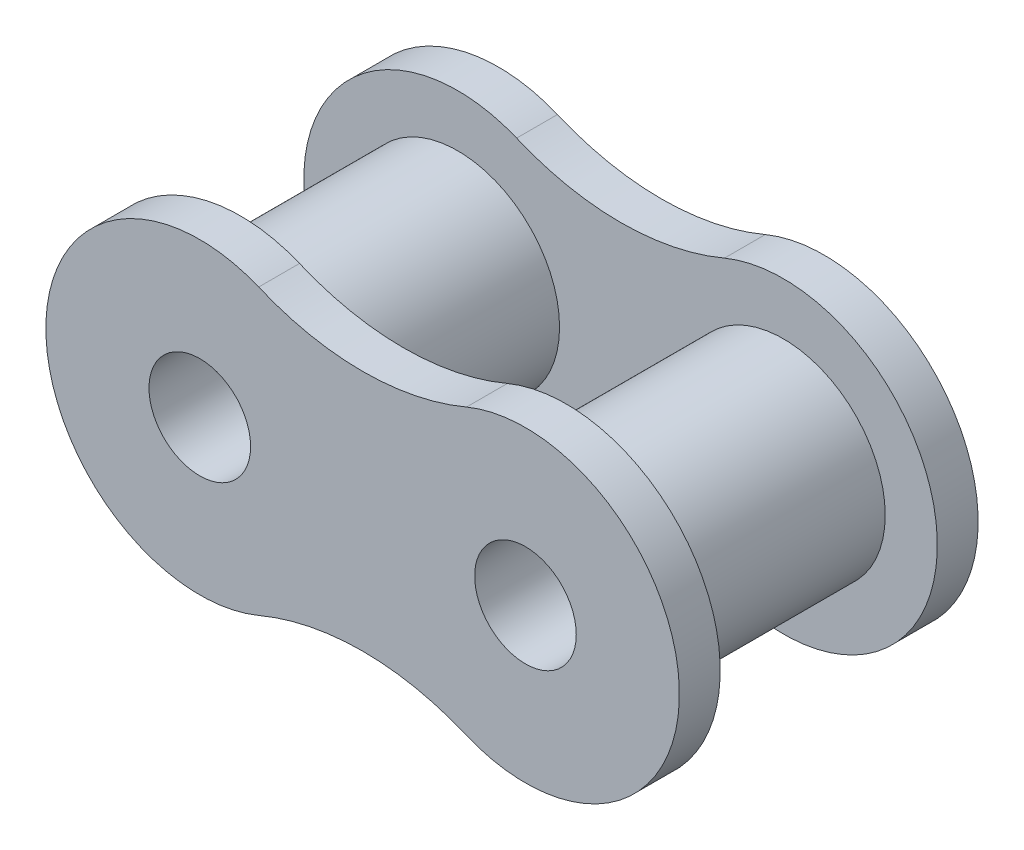
ISO-10303-21;
HEADER;
FILE_DESCRIPTION(('STEP AP214'),'2;1');
FILE_NAME('part.step','',(''),(''),'','','');
FILE_SCHEMA(('AUTOMOTIVE_DESIGN { 1 0 10303 214 1 1 1 1 }'));
ENDSEC;
DATA;
#1=APPLICATION_CONTEXT('core data for automotive mechanical design processes');
#2=APPLICATION_PROTOCOL_DEFINITION('international standard','automotive_design',2000,#1);
#3=PRODUCT_CONTEXT('',#1,'mechanical');
#4=PRODUCT('Part','Part','',(#3));
#5=PRODUCT_RELATED_PRODUCT_CATEGORY('part','',(#4));
#6=PRODUCT_DEFINITION_FORMATION('','',#4);
#7=PRODUCT_DEFINITION_CONTEXT('part definition',#1,'design');
#8=PRODUCT_DEFINITION('design','',#6,#7);
#9=PRODUCT_DEFINITION_SHAPE('','',#8);
#10=(LENGTH_UNIT() NAMED_UNIT(*) SI_UNIT(.MILLI.,.METRE.));
#11=(NAMED_UNIT(*) PLANE_ANGLE_UNIT() SI_UNIT($,.RADIAN.));
#12=(NAMED_UNIT(*) SI_UNIT($,.STERADIAN.) SOLID_ANGLE_UNIT());
#13=UNCERTAINTY_MEASURE_WITH_UNIT(LENGTH_MEASURE(1.E-05),#10,'distance_accuracy_value','');
#14=(GEOMETRIC_REPRESENTATION_CONTEXT(3) GLOBAL_UNCERTAINTY_ASSIGNED_CONTEXT((#13)) GLOBAL_UNIT_ASSIGNED_CONTEXT((#10,
#11,#12)) REPRESENTATION_CONTEXT('',''));
#15=CARTESIAN_POINT('',(0.,0.,0.));
#16=DIRECTION('',(0.,0.,1.));
#17=DIRECTION('',(1.,0.,0.));
#18=AXIS2_PLACEMENT_3D('',#15,#16,#17);
#19=CARTESIAN_POINT('',(0.,0.,2.3876));
#20=DIRECTION('',(0.,0.,1.));
#21=DIRECTION('',(1.,0.,0.));
#22=AXIS2_PLACEMENT_3D('',#19,#20,#21);
#23=PLANE('',#22);
#24=CARTESIAN_POINT('',(9.525,0.,2.3876));
#25=DIRECTION('',(0.,0.,1.));
#26=DIRECTION('',(1.,0.,0.));
#27=AXIS2_PLACEMENT_3D('',#24,#25,#26);
#28=CIRCLE('',#27,5.9563);
#29=CARTESIAN_POINT('',(15.4813,0.,2.3876));
#30=VERTEX_POINT('',#29);
#31=EDGE_CURVE('E144',#30,#30,#28,.T.);
#32=ORIENTED_EDGE('',*,*,#31,.F.);
#33=EDGE_LOOP('',(#32));
#34=FACE_BOUND('',#33,.T.);
#35=CARTESIAN_POINT('',(9.525,0.,2.3876));
#36=DIRECTION('',(0.,0.,1.));
#37=DIRECTION('',(1.,0.,0.));
#38=AXIS2_PLACEMENT_3D('',#35,#36,#37);
#39=CIRCLE('',#38,9.0043);
#40=CARTESIAN_POINT('',(6.07920356996496,-8.31888847459549,2.3876));
#41=VERTEX_POINT('',#40);
#42=CARTESIAN_POINT('',(6.07920356996453,8.31888847459532,2.3876));
#43=VERTEX_POINT('',#42);
#44=EDGE_CURVE('E79',#41,#43,#39,.T.);
#45=ORIENTED_EDGE('',*,*,#44,.T.);
#46=CARTESIAN_POINT('',(0.,22.6802142904542,2.3876));
#47=DIRECTION('',(0.,0.,1.));
#48=DIRECTION('',(1.,0.,0.));
#49=AXIS2_PLACEMENT_3D('',#46,#47,#48);
#50=CIRCLE('',#49,15.5950118702848);
#51=CARTESIAN_POINT('',(-6.07920356996596,8.31888847459591,2.3876));
#52=VERTEX_POINT('',#51);
#53=EDGE_CURVE('E153',#52,#43,#50,.T.);
#54=ORIENTED_EDGE('',*,*,#53,.F.);
#55=CARTESIAN_POINT('',(-9.525,0.,2.3876));
#56=DIRECTION('',(0.,0.,1.));
#57=DIRECTION('',(1.,0.,0.));
#58=AXIS2_PLACEMENT_3D('',#55,#56,#57);
#59=CIRCLE('',#58,9.0043);
#60=CARTESIAN_POINT('',(-6.07920356996638,-8.31888847459608,2.3876));
#61=VERTEX_POINT('',#60);
#62=EDGE_CURVE('E157',#52,#61,#59,.T.);
#63=ORIENTED_EDGE('',*,*,#62,.T.);
#64=CARTESIAN_POINT('',(0.,-22.6802142904542,2.3876));
#65=DIRECTION('',(0.,0.,1.));
#66=DIRECTION('',(1.,0.,0.));
#67=AXIS2_PLACEMENT_3D('',#64,#65,#66);
#68=CIRCLE('',#67,15.5950118702848);
#69=EDGE_CURVE('E52',#61,#41,#68,.F.);
#70=ORIENTED_EDGE('',*,*,#69,.T.);
#71=EDGE_LOOP('',(#45,#54,#63,#70));
#72=FACE_BOUND('',#71,.T.);
#73=CARTESIAN_POINT('',(-9.525,0.,2.3876));
#74=DIRECTION('',(0.,0.,1.));
#75=DIRECTION('',(1.,0.,0.));
#76=AXIS2_PLACEMENT_3D('',#73,#74,#75);
#77=CIRCLE('',#76,5.9563);
#78=CARTESIAN_POINT('',(-3.5687,0.,2.3876));
#79=VERTEX_POINT('',#78);
#80=EDGE_CURVE('E134',#79,#79,#77,.T.);
#81=ORIENTED_EDGE('',*,*,#80,.F.);
#82=EDGE_LOOP('',(#81));
#83=FACE_BOUND('',#82,.T.);
#84=ADVANCED_FACE('F35',(#34,#72,#83),#23,.T.);
#85=CARTESIAN_POINT('',(9.525,0.,2.3876));
#86=DIRECTION('',(0.,0.,-1.));
#87=DIRECTION('',(-1.,0.,0.));
#88=AXIS2_PLACEMENT_3D('',#85,#86,#87);
#89=CYLINDRICAL_SURFACE('',#88,9.0043);
#90=CARTESIAN_POINT('',(9.525,0.,0.));
#91=DIRECTION('',(0.,0.,1.));
#92=DIRECTION('',(1.,0.,0.));
#93=AXIS2_PLACEMENT_3D('',#90,#91,#92);
#94=CIRCLE('',#93,9.0043);
#95=CARTESIAN_POINT('',(6.07920356996496,-8.31888847459549,0.));
#96=VERTEX_POINT('',#95);
#97=CARTESIAN_POINT('',(6.07920356996453,8.31888847459532,0.));
#98=VERTEX_POINT('',#97);
#99=EDGE_CURVE('E149',#96,#98,#94,.T.);
#100=ORIENTED_EDGE('',*,*,#99,.T.);
#101=DIRECTION('',(0.,0.,-1.));
#102=VECTOR('',#101,1.);
#103=CARTESIAN_POINT('',(6.07920356996453,8.31888847459532,2.3876));
#104=LINE('',#103,#102);
#105=EDGE_CURVE('E11',#43,#98,#104,.T.);
#106=ORIENTED_EDGE('',*,*,#105,.F.);
#107=ORIENTED_EDGE('',*,*,#44,.F.);
#108=DIRECTION('',(0.,0.,-1.));
#109=VECTOR('',#108,1.);
#110=CARTESIAN_POINT('',(6.07920356996496,-8.31888847459549,2.3876));
#111=LINE('',#110,#109);
#112=EDGE_CURVE('E160',#41,#96,#111,.T.);
#113=ORIENTED_EDGE('',*,*,#112,.T.);
#114=EDGE_LOOP('',(#100,#106,#107,#113));
#115=FACE_BOUND('',#114,.T.);
#116=ADVANCED_FACE('F37',(#115),#89,.T.);
#117=CARTESIAN_POINT('',(0.,22.6802142904542,2.3876));
#118=DIRECTION('',(0.,0.,-1.));
#119=DIRECTION('',(-1.,0.,0.));
#120=AXIS2_PLACEMENT_3D('',#117,#118,#119);
#121=CYLINDRICAL_SURFACE('',#120,15.5950118702848);
#122=CARTESIAN_POINT('',(0.,22.6802142904542,0.));
#123=DIRECTION('',(0.,0.,1.));
#124=DIRECTION('',(1.,0.,0.));
#125=AXIS2_PLACEMENT_3D('',#122,#123,#124);
#126=CIRCLE('',#125,15.5950118702848);
#127=CARTESIAN_POINT('',(-6.07920356996596,8.31888847459591,0.));
#128=VERTEX_POINT('',#127);
#129=EDGE_CURVE('E163',#128,#98,#126,.T.);
#130=ORIENTED_EDGE('',*,*,#129,.F.);
#131=DIRECTION('',(0.,0.,-1.));
#132=VECTOR('',#131,1.);
#133=CARTESIAN_POINT('',(-6.07920356996596,8.31888847459591,2.3876));
#134=LINE('',#133,#132);
#135=EDGE_CURVE('E44',#52,#128,#134,.T.);
#136=ORIENTED_EDGE('',*,*,#135,.F.);
#137=ORIENTED_EDGE('',*,*,#53,.T.);
#138=ORIENTED_EDGE('',*,*,#105,.T.);
#139=EDGE_LOOP('',(#130,#136,#137,#138));
#140=FACE_BOUND('',#139,.T.);
#141=ADVANCED_FACE('F183',(#140),#121,.F.);
#142=CARTESIAN_POINT('',(-9.525,0.,2.3876));
#143=DIRECTION('',(0.,0.,-1.));
#144=DIRECTION('',(-1.,0.,0.));
#145=AXIS2_PLACEMENT_3D('',#142,#143,#144);
#146=CYLINDRICAL_SURFACE('',#145,9.0043);
#147=CARTESIAN_POINT('',(-9.525,0.,0.));
#148=DIRECTION('',(0.,0.,1.));
#149=DIRECTION('',(1.,0.,0.));
#150=AXIS2_PLACEMENT_3D('',#147,#148,#149);
#151=CIRCLE('',#150,9.0043);
#152=CARTESIAN_POINT('',(-6.07920356996638,-8.31888847459608,0.));
#153=VERTEX_POINT('',#152);
#154=EDGE_CURVE('E68',#128,#153,#151,.T.);
#155=ORIENTED_EDGE('',*,*,#154,.T.);
#156=DIRECTION('',(0.,0.,-1.));
#157=VECTOR('',#156,1.);
#158=CARTESIAN_POINT('',(-6.07920356996638,-8.31888847459608,2.3876));
#159=LINE('',#158,#157);
#160=EDGE_CURVE('E174',#61,#153,#159,.T.);
#161=ORIENTED_EDGE('',*,*,#160,.F.);
#162=ORIENTED_EDGE('',*,*,#62,.F.);
#163=ORIENTED_EDGE('',*,*,#135,.T.);
#164=EDGE_LOOP('',(#155,#161,#162,#163));
#165=FACE_BOUND('',#164,.T.);
#166=ADVANCED_FACE('F176',(#165),#146,.T.);
#167=CARTESIAN_POINT('',(-9.525,0.,2.3876));
#168=DIRECTION('',(0.,0.,-1.));
#169=DIRECTION('',(-1.,0.,0.));
#170=AXIS2_PLACEMENT_3D('',#167,#168,#169);
#171=CYLINDRICAL_SURFACE('',#170,2.9718);
#172=CARTESIAN_POINT('',(-9.525,0.,0.));
#173=DIRECTION('',(0.,0.,1.));
#174=DIRECTION('',(1.,0.,0.));
#175=AXIS2_PLACEMENT_3D('',#172,#173,#174);
#176=CIRCLE('',#175,2.9718);
#177=CARTESIAN_POINT('',(-6.5532,0.,0.));
#178=VERTEX_POINT('',#177);
#179=EDGE_CURVE('E168',#178,#178,#176,.T.);
#180=ORIENTED_EDGE('',*,*,#179,.F.);
#181=EDGE_LOOP('',(#180));
#182=FACE_BOUND('',#181,.T.);
#183=CARTESIAN_POINT('',(-9.525,0.,17.4752));
#184=DIRECTION('',(0.,0.,1.));
#185=DIRECTION('',(1.,0.,0.));
#186=AXIS2_PLACEMENT_3D('',#183,#184,#185);
#187=CIRCLE('',#186,2.9718);
#188=CARTESIAN_POINT('',(-6.5532,0.,17.4752));
#189=VERTEX_POINT('',#188);
#190=EDGE_CURVE('E395',#189,#189,#187,.T.);
#191=ORIENTED_EDGE('',*,*,#190,.T.);
#192=EDGE_LOOP('',(#191));
#193=FACE_BOUND('',#192,.T.);
#194=ADVANCED_FACE('F188',(#182,#193),#171,.F.);
#195=CARTESIAN_POINT('',(0.,-22.6802142904542,2.3876));
#196=DIRECTION('',(0.,0.,-1.));
#197=DIRECTION('',(-1.,0.,0.));
#198=AXIS2_PLACEMENT_3D('',#195,#196,#197);
#199=CYLINDRICAL_SURFACE('',#198,15.5950118702848);
#200=CARTESIAN_POINT('',(0.,-22.6802142904542,0.));
#201=DIRECTION('',(0.,0.,1.));
#202=DIRECTION('',(1.,0.,0.));
#203=AXIS2_PLACEMENT_3D('',#200,#201,#202);
#204=CIRCLE('',#203,15.5950118702848);
#205=EDGE_CURVE('E74',#153,#96,#204,.F.);
#206=ORIENTED_EDGE('',*,*,#205,.T.);
#207=ORIENTED_EDGE('',*,*,#112,.F.);
#208=ORIENTED_EDGE('',*,*,#69,.F.);
#209=ORIENTED_EDGE('',*,*,#160,.T.);
#210=EDGE_LOOP('',(#206,#207,#208,#209));
#211=FACE_BOUND('',#210,.T.);
#212=ADVANCED_FACE('F185',(#211),#199,.F.);
#213=CARTESIAN_POINT('',(9.525,0.,2.3876));
#214=DIRECTION('',(0.,0.,-1.));
#215=DIRECTION('',(-1.,0.,0.));
#216=AXIS2_PLACEMENT_3D('',#213,#214,#215);
#217=CYLINDRICAL_SURFACE('',#216,2.9718);
#218=CARTESIAN_POINT('',(9.525,0.,0.));
#219=DIRECTION('',(0.,0.,1.));
#220=DIRECTION('',(1.,0.,0.));
#221=AXIS2_PLACEMENT_3D('',#218,#219,#220);
#222=CIRCLE('',#221,2.9718);
#223=CARTESIAN_POINT('',(12.4968,0.,0.));
#224=VERTEX_POINT('',#223);
#225=EDGE_CURVE('E154',#224,#224,#222,.T.);
#226=ORIENTED_EDGE('',*,*,#225,.F.);
#227=EDGE_LOOP('',(#226));
#228=FACE_BOUND('',#227,.T.);
#229=CARTESIAN_POINT('',(9.525,0.,17.4752));
#230=DIRECTION('',(0.,0.,1.));
#231=DIRECTION('',(1.,0.,0.));
#232=AXIS2_PLACEMENT_3D('',#229,#230,#231);
#233=CIRCLE('',#232,2.9718);
#234=CARTESIAN_POINT('',(12.4968,0.,17.4752));
#235=VERTEX_POINT('',#234);
#236=EDGE_CURVE('E397',#235,#235,#233,.T.);
#237=ORIENTED_EDGE('',*,*,#236,.T.);
#238=EDGE_LOOP('',(#237));
#239=FACE_BOUND('',#238,.T.);
#240=ADVANCED_FACE('F187',(#228,#239),#217,.F.);
#241=CARTESIAN_POINT('',(0.,0.,0.));
#242=DIRECTION('',(0.,0.,1.));
#243=DIRECTION('',(1.,0.,0.));
#244=AXIS2_PLACEMENT_3D('',#241,#242,#243);
#245=PLANE('',#244);
#246=ORIENTED_EDGE('',*,*,#99,.F.);
#247=ORIENTED_EDGE('',*,*,#205,.F.);
#248=ORIENTED_EDGE('',*,*,#154,.F.);
#249=ORIENTED_EDGE('',*,*,#129,.T.);
#250=EDGE_LOOP('',(#246,#247,#248,#249));
#251=FACE_BOUND('',#250,.T.);
#252=ORIENTED_EDGE('',*,*,#179,.T.);
#253=EDGE_LOOP('',(#252));
#254=FACE_BOUND('',#253,.T.);
#255=ORIENTED_EDGE('',*,*,#225,.T.);
#256=EDGE_LOOP('',(#255));
#257=FACE_BOUND('',#256,.T.);
#258=ADVANCED_FACE('F181',(#251,#254,#257),#245,.F.);
#259=CARTESIAN_POINT('',(9.525,0.,15.0876));
#260=DIRECTION('',(0.,0.,-1.));
#261=DIRECTION('',(-1.,0.,0.));
#262=AXIS2_PLACEMENT_3D('',#259,#260,#261);
#263=CYLINDRICAL_SURFACE('',#262,5.9563);
#264=CARTESIAN_POINT('',(9.525,0.,15.0876));
#265=DIRECTION('',(0.,0.,1.));
#266=DIRECTION('',(1.,0.,0.));
#267=AXIS2_PLACEMENT_3D('',#264,#265,#266);
#268=CIRCLE('',#267,5.9563);
#269=CARTESIAN_POINT('',(15.4813,0.,15.0876));
#270=VERTEX_POINT('',#269);
#271=EDGE_CURVE('E146',#270,#270,#268,.T.);
#272=ORIENTED_EDGE('',*,*,#271,.F.);
#273=EDGE_LOOP('',(#272));
#274=FACE_BOUND('',#273,.T.);
#275=ORIENTED_EDGE('',*,*,#31,.T.);
#276=EDGE_LOOP('',(#275));
#277=FACE_BOUND('',#276,.T.);
#278=ADVANCED_FACE('F208',(#274,#277),#263,.T.);
#279=CARTESIAN_POINT('',(-9.525,0.,15.0876));
#280=DIRECTION('',(0.,0.,-1.));
#281=DIRECTION('',(-1.,0.,0.));
#282=AXIS2_PLACEMENT_3D('',#279,#280,#281);
#283=CYLINDRICAL_SURFACE('',#282,5.9563);
#284=CARTESIAN_POINT('',(-9.525,0.,15.0876));
#285=DIRECTION('',(0.,0.,1.));
#286=DIRECTION('',(1.,0.,0.));
#287=AXIS2_PLACEMENT_3D('',#284,#285,#286);
#288=CIRCLE('',#287,5.9563);
#289=CARTESIAN_POINT('',(-3.5687,0.,15.0876));
#290=VERTEX_POINT('',#289);
#291=EDGE_CURVE('E137',#290,#290,#288,.T.);
#292=ORIENTED_EDGE('',*,*,#291,.F.);
#293=EDGE_LOOP('',(#292));
#294=FACE_BOUND('',#293,.T.);
#295=ORIENTED_EDGE('',*,*,#80,.T.);
#296=EDGE_LOOP('',(#295));
#297=FACE_BOUND('',#296,.T.);
#298=ADVANCED_FACE('F214',(#294,#297),#283,.T.);
#299=CARTESIAN_POINT('',(-4.76250000000001,-11.3401071452271,15.0876));
#300=DIRECTION('',(0.,0.,1.));
#301=DIRECTION('',(1.,0.,0.));
#302=AXIS2_PLACEMENT_3D('',#299,#300,#301);
#303=PLANE('',#302);
#304=ORIENTED_EDGE('',*,*,#291,.T.);
#305=EDGE_LOOP('',(#304));
#306=FACE_BOUND('',#305,.T.);
#307=CARTESIAN_POINT('',(0.,-22.6802142904542,15.0876));
#308=DIRECTION('',(0.,0.,-1.));
#309=DIRECTION('',(1.,0.,0.));
#310=AXIS2_PLACEMENT_3D('',#307,#308,#309);
#311=CIRCLE('',#310,15.5950118702848);
#312=CARTESIAN_POINT('',(-6.07920356996638,-8.31888847459608,15.0876));
#313=VERTEX_POINT('',#312);
#314=CARTESIAN_POINT('',(6.07920356996496,-8.31888847459549,15.0876));
#315=VERTEX_POINT('',#314);
#316=EDGE_CURVE('E133',#313,#315,#311,.T.);
#317=ORIENTED_EDGE('',*,*,#316,.F.);
#318=CARTESIAN_POINT('',(-9.525,0.,15.0876));
#319=DIRECTION('',(0.,0.,1.));
#320=DIRECTION('',(1.,0.,0.));
#321=AXIS2_PLACEMENT_3D('',#318,#319,#320);
#322=CIRCLE('',#321,9.0043);
#323=CARTESIAN_POINT('',(-6.07920356996596,8.31888847459591,15.0876));
#324=VERTEX_POINT('',#323);
#325=EDGE_CURVE('E129',#324,#313,#322,.T.);
#326=ORIENTED_EDGE('',*,*,#325,.F.);
#327=CARTESIAN_POINT('',(0.,22.6802142904542,15.0876));
#328=DIRECTION('',(0.,0.,-1.));
#329=DIRECTION('',(1.,0.,0.));
#330=AXIS2_PLACEMENT_3D('',#327,#328,#329);
#331=CIRCLE('',#330,15.5950118702848);
#332=CARTESIAN_POINT('',(6.07920356996454,8.31888847459532,15.0876));
#333=VERTEX_POINT('',#332);
#334=EDGE_CURVE('E383',#333,#324,#331,.T.);
#335=ORIENTED_EDGE('',*,*,#334,.F.);
#336=CARTESIAN_POINT('',(9.525,0.,15.0876));
#337=DIRECTION('',(0.,0.,1.));
#338=DIRECTION('',(1.,0.,0.));
#339=AXIS2_PLACEMENT_3D('',#336,#337,#338);
#340=CIRCLE('',#339,9.0043);
#341=EDGE_CURVE('E386',#315,#333,#340,.T.);
#342=ORIENTED_EDGE('',*,*,#341,.F.);
#343=EDGE_LOOP('',(#317,#326,#335,#342));
#344=FACE_BOUND('',#343,.T.);
#345=ORIENTED_EDGE('',*,*,#271,.T.);
#346=EDGE_LOOP('',(#345));
#347=FACE_BOUND('',#346,.T.);
#348=ADVANCED_FACE('F219',(#306,#344,#347),#303,.F.);
#349=CARTESIAN_POINT('',(-4.76250000000001,-11.3401071452271,17.4752));
#350=DIRECTION('',(0.,0.,1.));
#351=DIRECTION('',(1.,0.,0.));
#352=AXIS2_PLACEMENT_3D('',#349,#350,#351);
#353=PLANE('',#352);
#354=ORIENTED_EDGE('',*,*,#190,.F.);
#355=EDGE_LOOP('',(#354));
#356=FACE_BOUND('',#355,.T.);
#357=CARTESIAN_POINT('',(0.,-22.6802142904542,17.4752));
#358=DIRECTION('',(0.,0.,-1.));
#359=DIRECTION('',(1.,0.,0.));
#360=AXIS2_PLACEMENT_3D('',#357,#358,#359);
#361=CIRCLE('',#360,15.5950118702848);
#362=CARTESIAN_POINT('',(-6.07920356996638,-8.31888847459608,17.4752));
#363=VERTEX_POINT('',#362);
#364=CARTESIAN_POINT('',(6.07920356996496,-8.31888847459549,17.4752));
#365=VERTEX_POINT('',#364);
#366=EDGE_CURVE('E119',#363,#365,#361,.T.);
#367=ORIENTED_EDGE('',*,*,#366,.T.);
#368=CARTESIAN_POINT('',(9.525,0.,17.4752));
#369=DIRECTION('',(0.,0.,1.));
#370=DIRECTION('',(1.,0.,0.));
#371=AXIS2_PLACEMENT_3D('',#368,#369,#370);
#372=CIRCLE('',#371,9.0043);
#373=CARTESIAN_POINT('',(6.07920356996454,8.31888847459532,17.4752));
#374=VERTEX_POINT('',#373);
#375=EDGE_CURVE('E108',#365,#374,#372,.T.);
#376=ORIENTED_EDGE('',*,*,#375,.T.);
#377=CARTESIAN_POINT('',(0.,22.6802142904542,17.4752));
#378=DIRECTION('',(0.,0.,-1.));
#379=DIRECTION('',(1.,0.,0.));
#380=AXIS2_PLACEMENT_3D('',#377,#378,#379);
#381=CIRCLE('',#380,15.5950118702848);
#382=CARTESIAN_POINT('',(-6.07920356996596,8.31888847459591,17.4752));
#383=VERTEX_POINT('',#382);
#384=EDGE_CURVE('E118',#374,#383,#381,.T.);
#385=ORIENTED_EDGE('',*,*,#384,.T.);
#386=CARTESIAN_POINT('',(-9.525,0.,17.4752));
#387=DIRECTION('',(0.,0.,1.));
#388=DIRECTION('',(1.,0.,0.));
#389=AXIS2_PLACEMENT_3D('',#386,#387,#388);
#390=CIRCLE('',#389,9.0043);
#391=EDGE_CURVE('E125',#383,#363,#390,.T.);
#392=ORIENTED_EDGE('',*,*,#391,.T.);
#393=EDGE_LOOP('',(#367,#376,#385,#392));
#394=FACE_BOUND('',#393,.T.);
#395=ORIENTED_EDGE('',*,*,#236,.F.);
#396=EDGE_LOOP('',(#395));
#397=FACE_BOUND('',#396,.T.);
#398=ADVANCED_FACE('F122',(#356,#394,#397),#353,.T.);
#399=CARTESIAN_POINT('',(0.,-22.6802142904542,17.4752));
#400=DIRECTION('',(0.,0.,-1.));
#401=DIRECTION('',(-1.,0.,0.));
#402=AXIS2_PLACEMENT_3D('',#399,#400,#401);
#403=CYLINDRICAL_SURFACE('',#402,15.5950118702848);
#404=ORIENTED_EDGE('',*,*,#316,.T.);
#405=DIRECTION('',(0.,0.,-1.));
#406=VECTOR('',#405,1.);
#407=CARTESIAN_POINT('',(6.07920356996496,-8.31888847459549,17.4752));
#408=LINE('',#407,#406);
#409=EDGE_CURVE('E112',#365,#315,#408,.T.);
#410=ORIENTED_EDGE('',*,*,#409,.F.);
#411=ORIENTED_EDGE('',*,*,#366,.F.);
#412=DIRECTION('',(0.,0.,-1.));
#413=VECTOR('',#412,1.);
#414=CARTESIAN_POINT('',(-6.07920356996638,-8.31888847459608,17.4752));
#415=LINE('',#414,#413);
#416=EDGE_CURVE('E388',#363,#313,#415,.T.);
#417=ORIENTED_EDGE('',*,*,#416,.T.);
#418=EDGE_LOOP('',(#404,#410,#411,#417));
#419=FACE_BOUND('',#418,.T.);
#420=ADVANCED_FACE('F131',(#419),#403,.F.);
#421=CARTESIAN_POINT('',(9.525,0.,17.4752));
#422=DIRECTION('',(0.,0.,-1.));
#423=DIRECTION('',(-1.,0.,0.));
#424=AXIS2_PLACEMENT_3D('',#421,#422,#423);
#425=CYLINDRICAL_SURFACE('',#424,9.0043);
#426=ORIENTED_EDGE('',*,*,#341,.T.);
#427=DIRECTION('',(0.,0.,-1.));
#428=VECTOR('',#427,1.);
#429=CARTESIAN_POINT('',(6.07920356996454,8.31888847459532,17.4752));
#430=LINE('',#429,#428);
#431=EDGE_CURVE('E115',#374,#333,#430,.T.);
#432=ORIENTED_EDGE('',*,*,#431,.F.);
#433=ORIENTED_EDGE('',*,*,#375,.F.);
#434=ORIENTED_EDGE('',*,*,#409,.T.);
#435=EDGE_LOOP('',(#426,#432,#433,#434));
#436=FACE_BOUND('',#435,.T.);
#437=ADVANCED_FACE('F110',(#436),#425,.T.);
#438=CARTESIAN_POINT('',(0.,22.6802142904542,17.4752));
#439=DIRECTION('',(0.,0.,-1.));
#440=DIRECTION('',(-1.,0.,0.));
#441=AXIS2_PLACEMENT_3D('',#438,#439,#440);
#442=CYLINDRICAL_SURFACE('',#441,15.5950118702848);
#443=ORIENTED_EDGE('',*,*,#334,.T.);
#444=DIRECTION('',(0.,0.,-1.));
#445=VECTOR('',#444,1.);
#446=CARTESIAN_POINT('',(-6.07920356996596,8.31888847459591,17.4752));
#447=LINE('',#446,#445);
#448=EDGE_CURVE('E139',#383,#324,#447,.T.);
#449=ORIENTED_EDGE('',*,*,#448,.F.);
#450=ORIENTED_EDGE('',*,*,#384,.F.);
#451=ORIENTED_EDGE('',*,*,#431,.T.);
#452=EDGE_LOOP('',(#443,#449,#450,#451));
#453=FACE_BOUND('',#452,.T.);
#454=ADVANCED_FACE('F237',(#453),#442,.F.);
#455=CARTESIAN_POINT('',(-9.525,0.,17.4752));
#456=DIRECTION('',(0.,0.,-1.));
#457=DIRECTION('',(-1.,0.,0.));
#458=AXIS2_PLACEMENT_3D('',#455,#456,#457);
#459=CYLINDRICAL_SURFACE('',#458,9.0043);
#460=ORIENTED_EDGE('',*,*,#325,.T.);
#461=ORIENTED_EDGE('',*,*,#416,.F.);
#462=ORIENTED_EDGE('',*,*,#391,.F.);
#463=ORIENTED_EDGE('',*,*,#448,.T.);
#464=EDGE_LOOP('',(#460,#461,#462,#463));
#465=FACE_BOUND('',#464,.T.);
#466=ADVANCED_FACE('F234',(#465),#459,.T.);
#467=CLOSED_SHELL('',(#84,#116,#141,#166,#194,#212,#240,#258,#278,#298,#348,#398,#420,#437,#454,#466));
#468=MANIFOLD_SOLID_BREP('B2',#467);
#469=ADVANCED_BREP_SHAPE_REPRESENTATION('',(#18,#468),#14);
#470=SHAPE_DEFINITION_REPRESENTATION(#9,#469);
ENDSEC;
END-ISO-10303-21;
